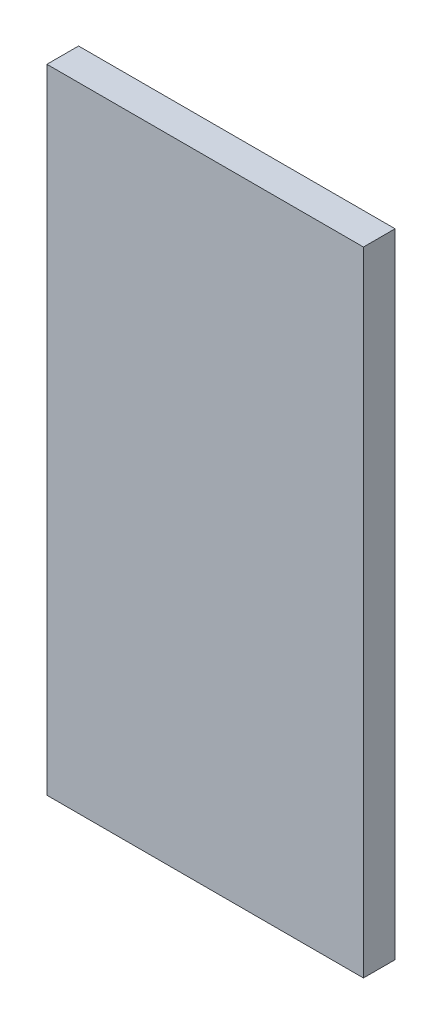
ISO-10303-21;
HEADER;
FILE_DESCRIPTION(('STEP AP214'),'2;1');
FILE_NAME('part.step','',(''),(''),'','','');
FILE_SCHEMA(('AUTOMOTIVE_DESIGN { 1 0 10303 214 1 1 1 1 }'));
ENDSEC;
DATA;
#1=APPLICATION_CONTEXT('core data for automotive mechanical design processes');
#2=APPLICATION_PROTOCOL_DEFINITION('international standard','automotive_design',2000,#1);
#3=PRODUCT_CONTEXT('',#1,'mechanical');
#4=PRODUCT('Part','Part','',(#3));
#5=PRODUCT_RELATED_PRODUCT_CATEGORY('part','',(#4));
#6=PRODUCT_DEFINITION_FORMATION('','',#4);
#7=PRODUCT_DEFINITION_CONTEXT('part definition',#1,'design');
#8=PRODUCT_DEFINITION('design','',#6,#7);
#9=PRODUCT_DEFINITION_SHAPE('','',#8);
#10=(LENGTH_UNIT() NAMED_UNIT(*) SI_UNIT(.MILLI.,.METRE.));
#11=(NAMED_UNIT(*) PLANE_ANGLE_UNIT() SI_UNIT($,.RADIAN.));
#12=(NAMED_UNIT(*) SI_UNIT($,.STERADIAN.) SOLID_ANGLE_UNIT());
#13=UNCERTAINTY_MEASURE_WITH_UNIT(LENGTH_MEASURE(1.E-05),#10,'distance_accuracy_value','');
#14=(GEOMETRIC_REPRESENTATION_CONTEXT(3) GLOBAL_UNCERTAINTY_ASSIGNED_CONTEXT((#13)) GLOBAL_UNIT_ASSIGNED_CONTEXT((#10,
#11,#12)) REPRESENTATION_CONTEXT('',''));
#15=CARTESIAN_POINT('',(0.,0.,0.));
#16=DIRECTION('',(0.,0.,1.));
#17=DIRECTION('',(1.,0.,0.));
#18=AXIS2_PLACEMENT_3D('',#15,#16,#17);
#19=CARTESIAN_POINT('',(0.,0.,1.));
#20=DIRECTION('',(1.,0.,0.));
#21=DIRECTION('',(0.,0.,-1.));
#22=AXIS2_PLACEMENT_3D('',#19,#20,#21);
#23=PLANE('',#22);
#24=DIRECTION('',(0.,-1.,0.));
#25=VECTOR('',#24,1.);
#26=CARTESIAN_POINT('',(0.,0.,0.));
#27=LINE('',#26,#25);
#28=CARTESIAN_POINT('',(0.,20.,0.));
#29=VERTEX_POINT('',#28);
#30=CARTESIAN_POINT('',(0.,0.,0.));
#31=VERTEX_POINT('',#30);
#32=EDGE_CURVE('E96',#29,#31,#27,.T.);
#33=ORIENTED_EDGE('',*,*,#32,.T.);
#34=DIRECTION('',(0.,0.,-1.));
#35=VECTOR('',#34,1.);
#36=CARTESIAN_POINT('',(0.,0.,1.));
#37=LINE('',#36,#35);
#38=CARTESIAN_POINT('',(0.,0.,1.));
#39=VERTEX_POINT('',#38);
#40=EDGE_CURVE('E11',#39,#31,#37,.T.);
#41=ORIENTED_EDGE('',*,*,#40,.F.);
#42=DIRECTION('',(0.,-1.,0.));
#43=VECTOR('',#42,1.);
#44=CARTESIAN_POINT('',(0.,0.,1.));
#45=LINE('',#44,#43);
#46=CARTESIAN_POINT('',(0.,20.,1.));
#47=VERTEX_POINT('',#46);
#48=EDGE_CURVE('E84',#47,#39,#45,.T.);
#49=ORIENTED_EDGE('',*,*,#48,.F.);
#50=DIRECTION('',(0.,0.,-1.));
#51=VECTOR('',#50,1.);
#52=CARTESIAN_POINT('',(0.,20.,1.));
#53=LINE('',#52,#51);
#54=EDGE_CURVE('E92',#47,#29,#53,.T.);
#55=ORIENTED_EDGE('',*,*,#54,.T.);
#56=EDGE_LOOP('',(#33,#41,#49,#55));
#57=FACE_BOUND('',#56,.T.);
#58=ADVANCED_FACE('F33',(#57),#23,.F.);
#59=CARTESIAN_POINT('',(0.,0.,1.));
#60=DIRECTION('',(0.,1.,0.));
#61=DIRECTION('',(0.,0.,1.));
#62=AXIS2_PLACEMENT_3D('',#59,#60,#61);
#63=PLANE('',#62);
#64=DIRECTION('',(1.,0.,0.));
#65=VECTOR('',#64,1.);
#66=CARTESIAN_POINT('',(0.,0.,0.));
#67=LINE('',#66,#65);
#68=CARTESIAN_POINT('',(10.,0.,0.));
#69=VERTEX_POINT('',#68);
#70=EDGE_CURVE('E88',#31,#69,#67,.T.);
#71=ORIENTED_EDGE('',*,*,#70,.T.);
#72=DIRECTION('',(0.,0.,-1.));
#73=VECTOR('',#72,1.);
#74=CARTESIAN_POINT('',(10.,0.,1.));
#75=LINE('',#74,#73);
#76=CARTESIAN_POINT('',(10.,0.,1.));
#77=VERTEX_POINT('',#76);
#78=EDGE_CURVE('E41',#77,#69,#75,.T.);
#79=ORIENTED_EDGE('',*,*,#78,.F.);
#80=DIRECTION('',(1.,0.,0.));
#81=VECTOR('',#80,1.);
#82=CARTESIAN_POINT('',(0.,0.,1.));
#83=LINE('',#82,#81);
#84=EDGE_CURVE('E79',#39,#77,#83,.T.);
#85=ORIENTED_EDGE('',*,*,#84,.F.);
#86=ORIENTED_EDGE('',*,*,#40,.T.);
#87=EDGE_LOOP('',(#71,#79,#85,#86));
#88=FACE_BOUND('',#87,.T.);
#89=ADVANCED_FACE('F87',(#88),#63,.F.);
#90=CARTESIAN_POINT('',(10.,0.,1.));
#91=DIRECTION('',(-1.,0.,0.));
#92=DIRECTION('',(0.,0.,1.));
#93=AXIS2_PLACEMENT_3D('',#90,#91,#92);
#94=PLANE('',#93);
#95=DIRECTION('',(0.,1.,0.));
#96=VECTOR('',#95,1.);
#97=CARTESIAN_POINT('',(10.,0.,0.));
#98=LINE('',#97,#96);
#99=CARTESIAN_POINT('',(10.,20.,0.));
#100=VERTEX_POINT('',#99);
#101=EDGE_CURVE('E66',#69,#100,#98,.T.);
#102=ORIENTED_EDGE('',*,*,#101,.T.);
#103=DIRECTION('',(0.,0.,-1.));
#104=VECTOR('',#103,1.);
#105=CARTESIAN_POINT('',(10.,20.,1.));
#106=LINE('',#105,#104);
#107=CARTESIAN_POINT('',(10.,20.,1.));
#108=VERTEX_POINT('',#107);
#109=EDGE_CURVE('E89',#108,#100,#106,.T.);
#110=ORIENTED_EDGE('',*,*,#109,.F.);
#111=DIRECTION('',(0.,1.,0.));
#112=VECTOR('',#111,1.);
#113=CARTESIAN_POINT('',(10.,0.,1.));
#114=LINE('',#113,#112);
#115=EDGE_CURVE('E82',#77,#108,#114,.T.);
#116=ORIENTED_EDGE('',*,*,#115,.F.);
#117=ORIENTED_EDGE('',*,*,#78,.T.);
#118=EDGE_LOOP('',(#102,#110,#116,#117));
#119=FACE_BOUND('',#118,.T.);
#120=ADVANCED_FACE('F90',(#119),#94,.F.);
#121=CARTESIAN_POINT('',(0.,20.,1.));
#122=DIRECTION('',(0.,-1.,0.));
#123=DIRECTION('',(0.,0.,-1.));
#124=AXIS2_PLACEMENT_3D('',#121,#122,#123);
#125=PLANE('',#124);
#126=DIRECTION('',(-1.,0.,0.));
#127=VECTOR('',#126,1.);
#128=CARTESIAN_POINT('',(0.,20.,0.));
#129=LINE('',#128,#127);
#130=EDGE_CURVE('E72',#100,#29,#129,.T.);
#131=ORIENTED_EDGE('',*,*,#130,.T.);
#132=ORIENTED_EDGE('',*,*,#54,.F.);
#133=DIRECTION('',(-1.,0.,0.));
#134=VECTOR('',#133,1.);
#135=CARTESIAN_POINT('',(0.,20.,1.));
#136=LINE('',#135,#134);
#137=EDGE_CURVE('E49',#108,#47,#136,.T.);
#138=ORIENTED_EDGE('',*,*,#137,.F.);
#139=ORIENTED_EDGE('',*,*,#109,.T.);
#140=EDGE_LOOP('',(#131,#132,#138,#139));
#141=FACE_BOUND('',#140,.T.);
#142=ADVANCED_FACE('F103',(#141),#125,.F.);
#143=CARTESIAN_POINT('',(0.,0.,1.));
#144=DIRECTION('',(0.,0.,-1.));
#145=DIRECTION('',(-1.,0.,0.));
#146=AXIS2_PLACEMENT_3D('',#143,#144,#145);
#147=PLANE('',#146);
#148=ORIENTED_EDGE('',*,*,#48,.T.);
#149=ORIENTED_EDGE('',*,*,#84,.T.);
#150=ORIENTED_EDGE('',*,*,#115,.T.);
#151=ORIENTED_EDGE('',*,*,#137,.T.);
#152=EDGE_LOOP('',(#148,#149,#150,#151));
#153=FACE_BOUND('',#152,.T.);
#154=ADVANCED_FACE('F80',(#153),#147,.F.);
#155=CARTESIAN_POINT('',(0.,0.,0.));
#156=DIRECTION('',(0.,0.,-1.));
#157=DIRECTION('',(-1.,0.,0.));
#158=AXIS2_PLACEMENT_3D('',#155,#156,#157);
#159=PLANE('',#158);
#160=ORIENTED_EDGE('',*,*,#32,.F.);
#161=ORIENTED_EDGE('',*,*,#130,.F.);
#162=ORIENTED_EDGE('',*,*,#101,.F.);
#163=ORIENTED_EDGE('',*,*,#70,.F.);
#164=EDGE_LOOP('',(#160,#161,#162,#163));
#165=FACE_BOUND('',#164,.T.);
#166=ADVANCED_FACE('F106',(#165),#159,.T.);
#167=CLOSED_SHELL('',(#58,#89,#120,#142,#154,#166));
#168=MANIFOLD_SOLID_BREP('B2',#167);
#169=ADVANCED_BREP_SHAPE_REPRESENTATION('',(#18,#168),#14);
#170=SHAPE_DEFINITION_REPRESENTATION(#9,#169);
ENDSEC;
END-ISO-10303-21;
